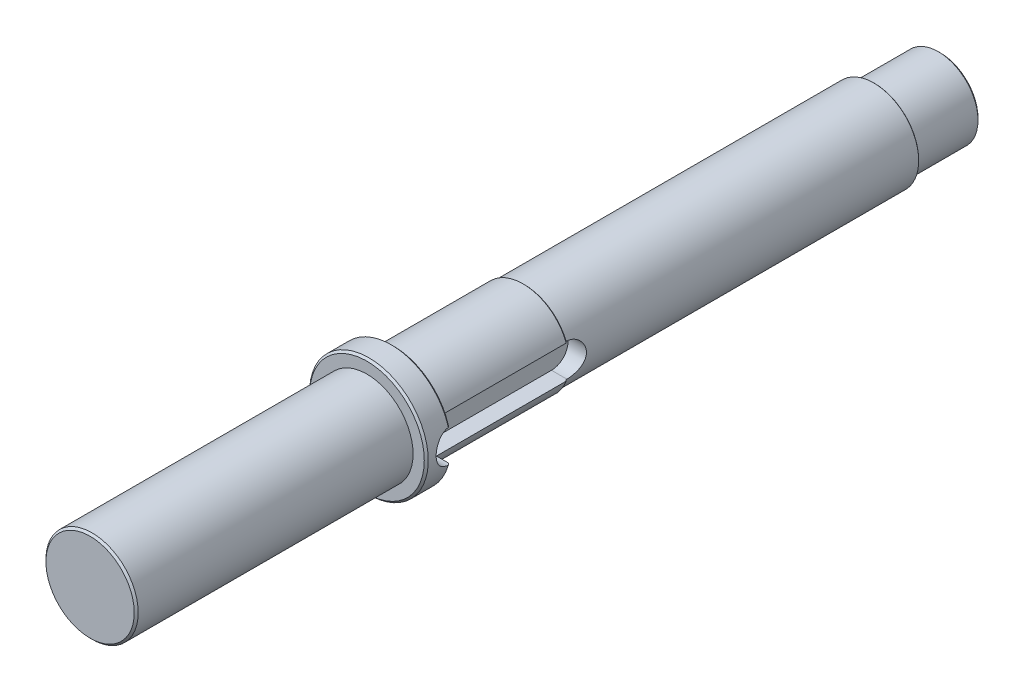
ISO-10303-21;
HEADER;
FILE_DESCRIPTION(('STEP AP214'),'2;1');
FILE_NAME('part.step','',(''),(''),'','','');
FILE_SCHEMA(('AUTOMOTIVE_DESIGN { 1 0 10303 214 1 1 1 1 }'));
ENDSEC;
DATA;
#1=APPLICATION_CONTEXT('core data for automotive mechanical design processes');
#2=APPLICATION_PROTOCOL_DEFINITION('international standard','automotive_design',2000,#1);
#3=PRODUCT_CONTEXT('',#1,'mechanical');
#4=PRODUCT('Part','Part','',(#3));
#5=PRODUCT_RELATED_PRODUCT_CATEGORY('part','',(#4));
#6=PRODUCT_DEFINITION_FORMATION('','',#4);
#7=PRODUCT_DEFINITION_CONTEXT('part definition',#1,'design');
#8=PRODUCT_DEFINITION('design','',#6,#7);
#9=PRODUCT_DEFINITION_SHAPE('','',#8);
#10=(LENGTH_UNIT() NAMED_UNIT(*) SI_UNIT(.MILLI.,.METRE.));
#11=(NAMED_UNIT(*) PLANE_ANGLE_UNIT() SI_UNIT($,.RADIAN.));
#12=(NAMED_UNIT(*) SI_UNIT($,.STERADIAN.) SOLID_ANGLE_UNIT());
#13=UNCERTAINTY_MEASURE_WITH_UNIT(LENGTH_MEASURE(1.E-05),#10,'distance_accuracy_value','');
#14=(GEOMETRIC_REPRESENTATION_CONTEXT(3) GLOBAL_UNCERTAINTY_ASSIGNED_CONTEXT((#13)) GLOBAL_UNIT_ASSIGNED_CONTEXT((#10,
#11,#12)) REPRESENTATION_CONTEXT('',''));
#15=CARTESIAN_POINT('',(0.,0.,0.));
#16=DIRECTION('',(0.,0.,1.));
#17=DIRECTION('',(1.,0.,0.));
#18=AXIS2_PLACEMENT_3D('',#15,#16,#17);
#19=CARTESIAN_POINT('',(9.,0.,63.));
#20=DIRECTION('',(-1.,0.,0.));
#21=DIRECTION('',(0.,0.,1.));
#22=AXIS2_PLACEMENT_3D('',#19,#20,#21);
#23=CYLINDRICAL_SURFACE('',#22,2.5);
#24=DIRECTION('',(-1.,0.,0.));
#25=VECTOR('',#24,1.);
#26=CARTESIAN_POINT('',(9.,-2.5,63.));
#27=LINE('',#26,#25);
#28=CARTESIAN_POINT('',(6.32376470150495,-2.5,63.));
#29=VERTEX_POINT('',#28);
#30=CARTESIAN_POINT('',(4.,-2.5,63.));
#31=VERTEX_POINT('',#30);
#32=EDGE_CURVE('E68',#29,#31,#27,.T.);
#33=ORIENTED_EDGE('',*,*,#32,.F.);
#34=CARTESIAN_POINT('',(6.37356514493163,-2.37016188124623,63.7951934712303));
#35=CARTESIAN_POINT('',(6.36560903279854,-2.39153918947446,63.7315005728365));
#36=CARTESIAN_POINT('',(6.35849112701255,-2.41036712051195,63.6668426227412));
#37=CARTESIAN_POINT('',(6.34611179206517,-2.44278285721172,63.5360436110059));
#38=CARTESIAN_POINT('',(6.34085062324014,-2.45636992806856,63.469902342769));
#39=CARTESIAN_POINT('',(6.33237438368822,-2.47813794354778,63.3367153361462));
#40=CARTESIAN_POINT('',(6.32915584266513,-2.48632805817163,63.2696713304812));
#41=CARTESIAN_POINT('',(6.32484895352499,-2.49726127326526,63.1350969664618));
#42=CARTESIAN_POINT('',(6.32376041690474,-2.50000485574788,63.0675666516763));
#43=CARTESIAN_POINT('',(6.32377327118864,-2.49999028795656,62.8648590757217));
#44=CARTESIAN_POINT('',(6.32815361881067,-2.48898558295727,62.7295727874858));
#45=CARTESIAN_POINT('',(6.34511123416583,-2.44541995148177,62.4631837502152));
#46=CARTESIAN_POINT('',(6.35768691739753,-2.41286319190065,62.3320801976213));
#47=CARTESIAN_POINT('',(6.38940621722796,-2.32756049215717,62.0778306817887));
#48=CARTESIAN_POINT('',(6.40853439592586,-2.27486197318259,61.9546668155758));
#49=CARTESIAN_POINT('',(6.45118956389566,-2.15091475882347,61.7188550864381));
#50=CARTESIAN_POINT('',(6.47471898386582,-2.07965580438688,61.6062130862747));
#51=CARTESIAN_POINT('',(6.5247771783579,-1.91698167943481,61.3893033307046));
#52=CARTESIAN_POINT('',(6.55139172585088,-1.82482711481568,61.2856096730952));
#53=CARTESIAN_POINT('',(6.60390141255396,-1.62455869151092,61.094758085939));
#54=CARTESIAN_POINT('',(6.62979648843883,-1.51644343327828,61.0076016080228));
#55=CARTESIAN_POINT('',(6.67897027851501,-1.28297440843904,60.8495395428462));
#56=CARTESIAN_POINT('',(6.70213632339768,-1.15717390886301,60.7792556255792));
#57=CARTESIAN_POINT('',(6.74221253047313,-0.894528779198144,60.6610825349088));
#58=CARTESIAN_POINT('',(6.75912454561806,-0.757687434966282,60.6131867272147));
#59=CARTESIAN_POINT('',(6.78417607227856,-0.482894271350383,60.5431583111232));
#60=CARTESIAN_POINT('',(6.79265147277447,-0.345225833420529,60.5200361894455));
#61=CARTESIAN_POINT('',(6.80107779298998,-0.0677204874504458,60.497045454306));
#62=CARTESIAN_POINT('',(6.80103144944619,0.0721157099938083,60.4971693754363));
#63=CARTESIAN_POINT('',(6.79263585252244,0.342914834966031,60.5200811589847));
#64=CARTESIAN_POINT('',(6.7846817612591,0.473983381070206,60.541790377567));
#65=CARTESIAN_POINT('',(6.76187851037833,0.730468697604359,60.6054480178424));
#66=CARTESIAN_POINT('',(6.74702881604509,0.855885028908849,60.6473980091052));
#67=CARTESIAN_POINT('',(6.71164586129282,1.099640331127,60.7508714124932));
#68=CARTESIAN_POINT('',(6.69103398485004,1.21785168279074,60.8126674656588));
#69=CARTESIAN_POINT('',(6.64622504566167,1.44250948935482,60.9538377085677));
#70=CARTESIAN_POINT('',(6.62202703939505,1.54895283515157,61.0332165271136));
#71=CARTESIAN_POINT('',(6.5709409617269,1.75341440541438,61.2125290995389));
#72=CARTESIAN_POINT('',(6.54397814009063,1.85062075426388,61.3133685747571));
#73=CARTESIAN_POINT('',(6.49149250626481,2.02707251262323,61.5301310006114));
#74=CARTESIAN_POINT('',(6.46597048291033,2.10630815347015,61.6460621012428));
#75=CARTESIAN_POINT('',(6.41878938621058,2.24604364715354,61.8928318837262));
#76=CARTESIAN_POINT('',(6.3972237934411,2.30611017393436,62.0239347353491));
#77=CARTESIAN_POINT('',(6.36149985463627,2.4029205834103,62.2952828169152));
#78=CARTESIAN_POINT('',(6.34732643309861,2.43971196605896,62.4355087787868));
#79=CARTESIAN_POINT('',(6.33319080596052,2.47605090769648,62.6476007591158));
#80=CARTESIAN_POINT('',(6.32966780273766,2.48502284949996,62.7177413138285));
#81=CARTESIAN_POINT('',(6.32495567501243,2.49699527839482,62.8585897269324));
#82=CARTESIAN_POINT('',(6.32376518117951,2.49999926906551,62.9292972279926));
#83=CARTESIAN_POINT('',(6.32376424415476,2.50000069691632,63.0674122183109));
#84=CARTESIAN_POINT('',(6.32484561048348,2.4972711763191,63.1348201375124));
#85=CARTESIAN_POINT('',(6.32913413223526,2.48638176878866,63.2691641734533));
#86=CARTESIAN_POINT('',(6.33234237795423,2.47821909666634,63.3361000304056));
#87=CARTESIAN_POINT('',(6.34080638270803,2.45648459770579,63.4693188370714));
#88=CARTESIAN_POINT('',(6.34607290689301,2.44288432251917,63.5355964438142));
#89=CARTESIAN_POINT('',(6.35846820594772,2.41042745190464,63.6666368154103));
#90=CARTESIAN_POINT('',(6.36559597619836,2.39157369171062,63.7314003769951));
#91=CARTESIAN_POINT('',(6.37356514493163,2.37016188124622,63.7951934712303));
#92=B_SPLINE_CURVE_WITH_KNOTS('',3,(#34,#35,#36,#37,#38,#39,#40,#41,#42,#43,#44,#45,#46,#47,#48,
#49,#50,#51,#52,#53,#54,#55,#56,#57,#58,#59,#60,#61,#62,#63,#64,#65,#66,#67,#68,#69,#70,#71,#72,
#73,#74,#75,#76,#77,#78,#79,#80,#81,#82,#83,#84,#85,#86,#87,#88,#89,#90,#91),.UNSPECIFIED.,.F.,
.F.,(4,2,2,2,2,2,2,2,2,2,2,2,2,2,2,2,2,2,2,2,2,2,2,2,2,2,2,2,4),(0.,0.202908502676743,
0.405845444219588,0.608436679126223,0.811009984104436,1.21617944255289,1.62127058801634,
2.02541381547106,2.42978090392483,2.85166381466666,3.27358374109724,3.70924410767984,
4.14477529262286,4.56217536526862,4.97944139116718,5.37685366089216,5.77429675288398,
6.17745182754345,6.5807131623901,7.00668105169829,7.4328799400492,7.86812419104442,
8.30247730482171,8.5146360076988,8.72667012263387,8.92883602984699,9.13110565299403,
9.33444765163933,9.5376801212376),.UNSPECIFIED.);
#93=CARTESIAN_POINT('',(6.32376470150495,2.5,63.));
#94=VERTEX_POINT('',#93);
#95=EDGE_CURVE('E137',#29,#94,#92,.T.);
#96=ORIENTED_EDGE('',*,*,#95,.T.);
#97=DIRECTION('',(-1.,0.,0.));
#98=VECTOR('',#97,1.);
#99=CARTESIAN_POINT('',(9.,2.5,63.));
#100=LINE('',#99,#98);
#101=CARTESIAN_POINT('',(4.,2.5,63.));
#102=VERTEX_POINT('',#101);
#103=EDGE_CURVE('E61',#94,#102,#100,.T.);
#104=ORIENTED_EDGE('',*,*,#103,.T.);
#105=CARTESIAN_POINT('',(4.,0.,63.));
#106=DIRECTION('',(1.,0.,0.));
#107=DIRECTION('',(0.,0.,-1.));
#108=AXIS2_PLACEMENT_3D('',#105,#106,#107);
#109=CIRCLE('',#108,2.5);
#110=EDGE_CURVE('E129',#31,#102,#109,.T.);
#111=ORIENTED_EDGE('',*,*,#110,.F.);
#112=EDGE_LOOP('',(#33,#96,#104,#111));
#113=FACE_BOUND('',#112,.T.);
#114=ADVANCED_FACE('F44',(#113),#23,.F.);
#115=CARTESIAN_POINT('',(0.,0.,129.));
#116=DIRECTION('',(0.,0.,-1.));
#117=DIRECTION('',(-1.,0.,0.));
#118=AXIS2_PLACEMENT_3D('',#115,#116,#117);
#119=CYLINDRICAL_SURFACE('',#118,7.);
#120=DIRECTION('',(0.,0.,-1.));
#121=VECTOR('',#120,1.);
#122=CARTESIAN_POINT('',(6.53834841531101,2.5,129.));
#123=LINE('',#122,#121);
#124=CARTESIAN_POINT('',(6.53834841531101,2.5,63.3));
#125=VERTEX_POINT('',#124);
#126=CARTESIAN_POINT('',(6.53834841531101,2.5,83.));
#127=VERTEX_POINT('',#126);
#128=EDGE_CURVE('E412',#125,#127,#123,.F.);
#129=ORIENTED_EDGE('',*,*,#128,.F.);
#130=CARTESIAN_POINT('',(0.,0.,63.3));
#131=DIRECTION('',(0.,0.,1.));
#132=DIRECTION('',(1.,0.,0.));
#133=AXIS2_PLACEMENT_3D('',#130,#131,#132);
#134=CIRCLE('',#133,7.);
#135=CARTESIAN_POINT('',(6.53834841531101,-2.5,63.3));
#136=VERTEX_POINT('',#135);
#137=EDGE_CURVE('E448',#125,#136,#134,.T.);
#138=ORIENTED_EDGE('',*,*,#137,.T.);
#139=DIRECTION('',(0.,0.,-1.));
#140=VECTOR('',#139,1.);
#141=CARTESIAN_POINT('',(6.53834841531101,-2.5,129.));
#142=LINE('',#141,#140);
#143=CARTESIAN_POINT('',(6.53834841531101,-2.5,83.));
#144=VERTEX_POINT('',#143);
#145=EDGE_CURVE('E407',#144,#136,#142,.T.);
#146=ORIENTED_EDGE('',*,*,#145,.F.);
#147=CARTESIAN_POINT('',(0.,0.,83.));
#148=DIRECTION('',(0.,0.,1.));
#149=DIRECTION('',(1.,0.,0.));
#150=AXIS2_PLACEMENT_3D('',#147,#148,#149);
#151=CIRCLE('',#150,7.);
#152=EDGE_CURVE('E157',#127,#144,#151,.T.);
#153=ORIENTED_EDGE('',*,*,#152,.F.);
#154=EDGE_LOOP('',(#129,#138,#146,#153));
#155=FACE_BOUND('',#154,.T.);
#156=ADVANCED_FACE('F220',(#155),#119,.T.);
#157=CARTESIAN_POINT('',(0.,0.,87.));
#158=DIRECTION('',(0.,0.,-1.));
#159=DIRECTION('',(-1.,0.,0.));
#160=AXIS2_PLACEMENT_3D('',#157,#158,#159);
#161=CYLINDRICAL_SURFACE('',#160,9.);
#162=CARTESIAN_POINT('',(0.,0.,86.7000000000001));
#163=DIRECTION('',(0.,0.,1.));
#164=DIRECTION('',(1.,0.,0.));
#165=AXIS2_PLACEMENT_3D('',#162,#163,#164);
#166=CIRCLE('',#165,9.);
#167=CARTESIAN_POINT('',(9.,0.,86.7000000000001));
#168=VERTEX_POINT('',#167);
#169=EDGE_CURVE('E182',#168,#168,#166,.F.);
#170=ORIENTED_EDGE('',*,*,#169,.T.);
#171=EDGE_LOOP('',(#170));
#172=FACE_BOUND('',#171,.T.);
#173=CARTESIAN_POINT('',(8.64580823289529,2.5,83.));
#174=CARTESIAN_POINT('',(8.64579950821757,2.50000830602292,83.0688585199836));
#175=CARTESIAN_POINT('',(8.64663065807681,2.49715524603601,83.1377119002342));
#176=CARTESIAN_POINT('',(8.64990792871954,2.48579096319931,83.2748981823844));
#177=CARTESIAN_POINT('',(8.65235372954183,2.4772808613535,83.3432311846896));
#178=CARTESIAN_POINT('',(8.6587882563543,2.4546926967716,83.4787401301999));
#179=CARTESIAN_POINT('',(8.66277346547357,2.44062732375281,83.5459183488119));
#180=CARTESIAN_POINT('',(8.67215936886944,2.40706322245487,83.6787842144562));
#181=CARTESIAN_POINT('',(8.6775600918511,2.38756438399059,83.7444718312315));
#182=CARTESIAN_POINT('',(8.69565518457922,2.3211450863276,83.9385854375999));
#183=CARTESIAN_POINT('',(8.71025040337274,2.26627569938269,84.0642174618709));
#184=CARTESIAN_POINT('',(8.7428505104496,2.13704900713883,84.3044808215494));
#185=CARTESIAN_POINT('',(8.76085667251656,2.0626844175502,84.419108023139));
#186=CARTESIAN_POINT('',(8.79879412854936,1.89441897395304,84.6372530627462));
#187=CARTESIAN_POINT('',(8.81876164554148,1.80008616533364,84.7404320670644));
#188=CARTESIAN_POINT('',(8.85806142034494,1.59548835100877,84.9297278350093));
#189=CARTESIAN_POINT('',(8.87739357335314,1.48522073288934,85.0158417954271));
#190=CARTESIAN_POINT('',(8.91365243290547,1.24949780504099,85.1700058121654));
#191=CARTESIAN_POINT('',(8.93053115307204,1.12381058827198,85.2377135788813));
#192=CARTESIAN_POINT('',(8.95956074597986,0.862294107712378,85.3509014780864));
#193=CARTESIAN_POINT('',(8.9717127021874,0.726467176659815,85.3963867050267));
#194=CARTESIAN_POINT('',(8.98966308671867,0.452087826563251,85.4627305623294));
#195=CARTESIAN_POINT('',(8.99561125337261,0.313685954719504,85.4841705752483));
#196=CARTESIAN_POINT('',(9.00100868484384,0.0351274681096858,85.5036475046721));
#197=CARTESIAN_POINT('',(9.00045898712353,-0.105028862966262,85.5016881571664));
#198=CARTESIAN_POINT('',(8.99303084531464,-0.379054928934811,85.4748243813654));
#199=CARTESIAN_POINT('',(8.98632591253905,-0.512991760209219,85.4505489989795));
#200=CARTESIAN_POINT('',(8.96754747987061,-0.774808772562582,85.3807623952707));
#201=CARTESIAN_POINT('',(8.95547371543655,-0.902688654850765,85.3352501275264));
#202=CARTESIAN_POINT('',(8.92706237810073,-1.15033469909429,85.2238174539704));
#203=CARTESIAN_POINT('',(8.91068121327166,-1.27000115579177,85.1576870379234));
#204=CARTESIAN_POINT('',(8.87541187730876,-1.49674649921308,85.0070587426061));
#205=CARTESIAN_POINT('',(8.85652322703191,-1.60382297278662,84.9225573509439));
#206=CARTESIAN_POINT('',(8.81753868463739,-1.80609604775247,84.7342817831259));
#207=CARTESIAN_POINT('',(8.7974235289556,-1.90078144217944,84.629961776031));
#208=CARTESIAN_POINT('',(8.75880771863634,-2.0714653277718,84.4066902615497));
#209=CARTESIAN_POINT('',(8.74030751735181,-2.14745858245886,84.287734668071));
#210=CARTESIAN_POINT('',(8.70692961253113,-2.279043092931,84.0373640860905));
#211=CARTESIAN_POINT('',(8.69208091884035,-2.3344726387262,83.9058601594505));
#212=CARTESIAN_POINT('',(8.66804909513355,-2.42219486985499,83.6349559848876));
#213=CARTESIAN_POINT('',(8.65885741633596,-2.45452247840333,83.4955680010343));
#214=CARTESIAN_POINT('',(8.65066448386834,-2.48315519772344,83.2957662361188));
#215=CARTESIAN_POINT('',(8.648846818658,-2.4894721783985,83.2367582336104));
#216=CARTESIAN_POINT('',(8.64641887399254,-2.49789031419067,83.1185098325248));
#217=CARTESIAN_POINT('',(8.6458067220955,-2.49999800738002,83.0592699377821));
#218=CARTESIAN_POINT('',(8.64580823289529,-2.5,83.));
#219=B_SPLINE_CURVE_WITH_KNOTS('',3,(#173,#174,#175,#176,#177,#178,#179,#180,#181,#182,#183,
#184,#185,#186,#187,#188,#189,#190,#191,#192,#193,#194,#195,#196,#197,#198,#199,#200,#201,#202,
#203,#204,#205,#206,#207,#208,#209,#210,#211,#212,#213,#214,#215,#216,#217,#218),.UNSPECIFIED.,
.F.,.F.,(4,2,2,2,2,2,2,2,2,2,2,2,2,2,2,2,2,2,2,2,2,2,4),(0.,0.206502660795448,0.412964413050587,
0.618957254291897,0.824954273161065,1.23648126604288,1.64816224372851,2.06987642360528,
2.49165981952702,2.92082040021561,3.34988255089612,3.76833045963872,4.18671155902949,
4.59364934888086,5.00060719220963,5.41185362819258,5.82317876064753,6.24813326230631,
6.67320667689378,7.10155530371389,7.52925501790107,7.70724135419257,7.88495101767148),.UNSPECIFIED.);
#220=CARTESIAN_POINT('',(8.65101150155287,2.48193472919817,83.3));
#221=VERTEX_POINT('',#220);
#222=CARTESIAN_POINT('',(8.65101150155287,-2.48193472919817,83.3));
#223=VERTEX_POINT('',#222);
#224=EDGE_CURVE('E148',#221,#223,#219,.T.);
#225=ORIENTED_EDGE('',*,*,#224,.F.);
#226=CARTESIAN_POINT('',(0.,0.,83.3));
#227=DIRECTION('',(0.,0.,1.));
#228=DIRECTION('',(1.,0.,0.));
#229=AXIS2_PLACEMENT_3D('',#226,#227,#228);
#230=CIRCLE('',#229,9.);
#231=EDGE_CURVE('E423',#221,#223,#230,.T.);
#232=ORIENTED_EDGE('',*,*,#231,.T.);
#233=EDGE_LOOP('',(#225,#232));
#234=FACE_BOUND('',#233,.T.);
#235=ADVANCED_FACE('F159',(#172,#234),#161,.T.);
#236=CARTESIAN_POINT('',(0.,0.,83.));
#237=DIRECTION('',(0.,0.,1.));
#238=DIRECTION('',(1.,0.,0.));
#239=AXIS2_PLACEMENT_3D('',#236,#237,#238);
#240=PLANE('',#239);
#241=DIRECTION('',(-1.,0.,0.));
#242=VECTOR('',#241,1.);
#243=CARTESIAN_POINT('',(9.,-2.5,83.));
#244=LINE('',#243,#242);
#245=CARTESIAN_POINT('',(8.33306666239983,-2.5,83.));
#246=VERTEX_POINT('',#245);
#247=EDGE_CURVE('E119',#246,#144,#244,.T.);
#248=ORIENTED_EDGE('',*,*,#247,.F.);
#249=CARTESIAN_POINT('',(0.,0.,83.));
#250=DIRECTION('',(0.,0.,1.));
#251=DIRECTION('',(1.,0.,0.));
#252=AXIS2_PLACEMENT_3D('',#249,#250,#251);
#253=CIRCLE('',#252,8.69999999999997);
#254=CARTESIAN_POINT('',(8.33306666239983,2.5,83.));
#255=VERTEX_POINT('',#254);
#256=EDGE_CURVE('E446',#246,#255,#253,.F.);
#257=ORIENTED_EDGE('',*,*,#256,.T.);
#258=DIRECTION('',(-1.,0.,0.));
#259=VECTOR('',#258,1.);
#260=CARTESIAN_POINT('',(9.,2.5,83.));
#261=LINE('',#260,#259);
#262=EDGE_CURVE('E145',#255,#127,#261,.T.);
#263=ORIENTED_EDGE('',*,*,#262,.T.);
#264=ORIENTED_EDGE('',*,*,#152,.T.);
#265=EDGE_LOOP('',(#248,#257,#263,#264));
#266=FACE_BOUND('',#265,.T.);
#267=ADVANCED_FACE('F283',(#266),#240,.F.);
#268=CARTESIAN_POINT('',(0.,0.,128.7));
#269=DIRECTION('',(0.,0.,1.));
#270=DIRECTION('',(1.,0.,0.));
#271=AXIS2_PLACEMENT_3D('',#268,#269,#270);
#272=CIRCLE('',#271,7.);
#273=CARTESIAN_POINT('',(7.,0.,128.7));
#274=VERTEX_POINT('',#273);
#275=EDGE_CURVE('E418',#274,#274,#272,.F.);
#276=ORIENTED_EDGE('',*,*,#275,.T.);
#277=EDGE_LOOP('',(#276));
#278=FACE_BOUND('',#277,.T.);
#279=CARTESIAN_POINT('',(0.,0.,87.));
#280=DIRECTION('',(0.,0.,1.));
#281=DIRECTION('',(1.,0.,0.));
#282=AXIS2_PLACEMENT_3D('',#279,#280,#281);
#283=CIRCLE('',#282,7.);
#284=CARTESIAN_POINT('',(7.,0.,87.));
#285=VERTEX_POINT('',#284);
#286=EDGE_CURVE('E156',#285,#285,#283,.T.);
#287=ORIENTED_EDGE('',*,*,#286,.T.);
#288=EDGE_LOOP('',(#287));
#289=FACE_BOUND('',#288,.T.);
#290=ADVANCED_FACE('F226',(#278,#289),#119,.T.);
#291=CARTESIAN_POINT('',(0.,0.,129.));
#292=DIRECTION('',(0.,0.,1.));
#293=DIRECTION('',(1.,0.,0.));
#294=AXIS2_PLACEMENT_3D('',#291,#292,#293);
#295=PLANE('',#294);
#296=CARTESIAN_POINT('',(0.,0.,129.));
#297=DIRECTION('',(0.,0.,1.));
#298=DIRECTION('',(1.,0.,0.));
#299=AXIS2_PLACEMENT_3D('',#296,#297,#298);
#300=CIRCLE('',#299,6.70000000000003);
#301=CARTESIAN_POINT('',(6.70000000000003,0.,129.));
#302=VERTEX_POINT('',#301);
#303=EDGE_CURVE('E410',#302,#302,#300,.T.);
#304=ORIENTED_EDGE('',*,*,#303,.T.);
#305=EDGE_LOOP('',(#304));
#306=FACE_BOUND('',#305,.T.);
#307=ADVANCED_FACE('F270',(#306),#295,.T.);
#308=CARTESIAN_POINT('',(0.,0.,87.));
#309=DIRECTION('',(0.,0.,1.));
#310=DIRECTION('',(1.,0.,0.));
#311=AXIS2_PLACEMENT_3D('',#308,#309,#310);
#312=PLANE('',#311);
#313=CARTESIAN_POINT('',(0.,0.,87.));
#314=DIRECTION('',(0.,0.,1.));
#315=DIRECTION('',(1.,0.,0.));
#316=AXIS2_PLACEMENT_3D('',#313,#314,#315);
#317=CIRCLE('',#316,8.70000000000004);
#318=CARTESIAN_POINT('',(8.70000000000004,0.,87.));
#319=VERTEX_POINT('',#318);
#320=EDGE_CURVE('E421',#319,#319,#317,.T.);
#321=ORIENTED_EDGE('',*,*,#320,.T.);
#322=EDGE_LOOP('',(#321));
#323=FACE_BOUND('',#322,.T.);
#324=ORIENTED_EDGE('',*,*,#286,.F.);
#325=EDGE_LOOP('',(#324));
#326=FACE_BOUND('',#325,.T.);
#327=ADVANCED_FACE('F167',(#323,#326),#312,.T.);
#328=CARTESIAN_POINT('',(9.,0.,83.));
#329=DIRECTION('',(-1.,0.,0.));
#330=DIRECTION('',(0.,0.,1.));
#331=AXIS2_PLACEMENT_3D('',#328,#329,#330);
#332=CYLINDRICAL_SURFACE('',#331,2.5);
#333=ORIENTED_EDGE('',*,*,#224,.T.);
#334=CARTESIAN_POINT('',(8.65101150155287,-2.48193472919817,83.3));
#335=CARTESIAN_POINT('',(8.59774588886833,-2.48793626186972,83.2504713313555));
#336=CARTESIAN_POINT('',(8.54461767862646,-2.49244246743923,83.2007069964235));
#337=CARTESIAN_POINT('',(8.43863606558872,-2.49846422422866,83.1007069964007));
#338=CARTESIAN_POINT('',(8.38578266277958,-2.4999797755931,83.0504713313327));
#339=CARTESIAN_POINT('',(8.33306666239983,-2.5,83.));
#340=B_SPLINE_CURVE_WITH_KNOTS('',3,(#334,#335,#336,#337,#338,#339),.UNSPECIFIED.,.F.,.F.,(4,2,
4),(0.,0.218802684604842,0.437605358636508),.UNSPECIFIED.);
#341=EDGE_CURVE('E181',#223,#246,#340,.T.);
#342=ORIENTED_EDGE('',*,*,#341,.T.);
#343=ORIENTED_EDGE('',*,*,#247,.T.);
#344=CARTESIAN_POINT('',(4.,-2.5,83.));
#345=VERTEX_POINT('',#344);
#346=EDGE_CURVE('E111',#144,#345,#244,.T.);
#347=ORIENTED_EDGE('',*,*,#346,.T.);
#348=CARTESIAN_POINT('',(4.,0.,83.));
#349=DIRECTION('',(1.,0.,0.));
#350=DIRECTION('',(0.,0.,-1.));
#351=AXIS2_PLACEMENT_3D('',#348,#349,#350);
#352=CIRCLE('',#351,2.5);
#353=CARTESIAN_POINT('',(4.,2.5,83.));
#354=VERTEX_POINT('',#353);
#355=EDGE_CURVE('E117',#354,#345,#352,.T.);
#356=ORIENTED_EDGE('',*,*,#355,.F.);
#357=EDGE_CURVE('E143',#127,#354,#261,.T.);
#358=ORIENTED_EDGE('',*,*,#357,.F.);
#359=ORIENTED_EDGE('',*,*,#262,.F.);
#360=CARTESIAN_POINT('',(8.33306666239983,2.5,83.));
#361=CARTESIAN_POINT('',(8.38578266277958,2.4999797755931,83.0504713313327));
#362=CARTESIAN_POINT('',(8.43863606558872,2.49846422422866,83.1007069964007));
#363=CARTESIAN_POINT('',(8.54461767862645,2.49244246743923,83.2007069964235));
#364=CARTESIAN_POINT('',(8.59774588886832,2.48793626186972,83.2504713313555));
#365=CARTESIAN_POINT('',(8.65101150155287,2.48193472919817,83.3));
#366=B_SPLINE_CURVE_WITH_KNOTS('',3,(#360,#361,#362,#363,#364,#365),.UNSPECIFIED.,.F.,.F.,(4,2,
4),(0.,0.218802674031663,0.437605358636504),.UNSPECIFIED.);
#367=EDGE_CURVE('E174',#255,#221,#366,.T.);
#368=ORIENTED_EDGE('',*,*,#367,.T.);
#369=EDGE_LOOP('',(#333,#342,#343,#347,#356,#358,#359,#368));
#370=FACE_BOUND('',#369,.T.);
#371=ADVANCED_FACE('F114',(#370),#332,.F.);
#372=CARTESIAN_POINT('',(9.,-2.5,83.));
#373=DIRECTION('',(0.,1.,0.));
#374=DIRECTION('',(0.,0.,1.));
#375=AXIS2_PLACEMENT_3D('',#372,#373,#374);
#376=PLANE('',#375);
#377=ORIENTED_EDGE('',*,*,#145,.T.);
#378=CARTESIAN_POINT('',(6.53834841531101,-2.5,63.3));
#379=CARTESIAN_POINT('',(6.48472566113769,-2.5,63.2499098132056));
#380=CARTESIAN_POINT('',(6.43106092545432,-2.5,63.1998647201937));
#381=CARTESIAN_POINT('',(6.32364748940925,-2.5,63.0998647201909));
#382=CARTESIAN_POINT('',(6.26989878904495,-2.5,63.0499098132029));
#383=CARTESIAN_POINT('',(6.21610810716802,-2.5,63.));
#384=B_SPLINE_CURVE_WITH_KNOTS('',3,(#378,#379,#380,#381,#382,#383),.UNSPECIFIED.,.F.,.F.,(4,2,
4),(0.,0.220135723395464,0.44027145358787),.UNSPECIFIED.);
#385=CARTESIAN_POINT('',(6.32376470150495,-2.5,63.1));
#386=VERTEX_POINT('',#385);
#387=EDGE_CURVE('E450',#136,#386,#384,.T.);
#388=ORIENTED_EDGE('',*,*,#387,.T.);
#389=DIRECTION('',(0.,0.,-1.));
#390=VECTOR('',#389,1.);
#391=CARTESIAN_POINT('',(6.32376470150495,-2.5,115.142869257817));
#392=LINE('',#391,#390);
#393=EDGE_CURVE('E54',#386,#29,#392,.T.);
#394=ORIENTED_EDGE('',*,*,#393,.T.);
#395=ORIENTED_EDGE('',*,*,#32,.T.);
#396=DIRECTION('',(0.,0.,-1.));
#397=VECTOR('',#396,1.);
#398=CARTESIAN_POINT('',(4.,-2.5,83.));
#399=LINE('',#398,#397);
#400=EDGE_CURVE('E125',#345,#31,#399,.T.);
#401=ORIENTED_EDGE('',*,*,#400,.F.);
#402=ORIENTED_EDGE('',*,*,#346,.F.);
#403=EDGE_LOOP('',(#377,#388,#394,#395,#401,#402));
#404=FACE_BOUND('',#403,.T.);
#405=ADVANCED_FACE('F126',(#404),#376,.T.);
#406=CARTESIAN_POINT('',(9.,2.5,83.));
#407=DIRECTION('',(0.,-1.,0.));
#408=DIRECTION('',(0.,0.,-1.));
#409=AXIS2_PLACEMENT_3D('',#406,#407,#408);
#410=PLANE('',#409);
#411=ORIENTED_EDGE('',*,*,#103,.F.);
#412=DIRECTION('',(0.,0.,-1.));
#413=VECTOR('',#412,1.);
#414=CARTESIAN_POINT('',(6.32376470150495,2.5,115.142869257817));
#415=LINE('',#414,#413);
#416=CARTESIAN_POINT('',(6.32376470150495,2.5,63.1));
#417=VERTEX_POINT('',#416);
#418=EDGE_CURVE('E13',#417,#94,#415,.T.);
#419=ORIENTED_EDGE('',*,*,#418,.F.);
#420=CARTESIAN_POINT('',(6.21610810716802,2.5,63.));
#421=CARTESIAN_POINT('',(6.26989878904495,2.5,63.0499098132029));
#422=CARTESIAN_POINT('',(6.32364748940925,2.5,63.0998647201909));
#423=CARTESIAN_POINT('',(6.43106092545432,2.5,63.1998647201937));
#424=CARTESIAN_POINT('',(6.48472566113769,2.5,63.2499098132056));
#425=CARTESIAN_POINT('',(6.53834841531101,2.5,63.3));
#426=B_SPLINE_CURVE_WITH_KNOTS('',3,(#420,#421,#422,#423,#424,#425),.UNSPECIFIED.,.F.,.F.,(4,2,
4),(0.,0.220135730192405,0.440271453587868),.UNSPECIFIED.);
#427=EDGE_CURVE('E440',#417,#125,#426,.T.);
#428=ORIENTED_EDGE('',*,*,#427,.T.);
#429=ORIENTED_EDGE('',*,*,#128,.T.);
#430=ORIENTED_EDGE('',*,*,#357,.T.);
#431=DIRECTION('',(0.,0.,1.));
#432=VECTOR('',#431,1.);
#433=CARTESIAN_POINT('',(4.,2.5,83.));
#434=LINE('',#433,#432);
#435=EDGE_CURVE('E133',#102,#354,#434,.T.);
#436=ORIENTED_EDGE('',*,*,#435,.F.);
#437=EDGE_LOOP('',(#411,#419,#428,#429,#430,#436));
#438=FACE_BOUND('',#437,.T.);
#439=ADVANCED_FACE('F229',(#438),#410,.T.);
#440=CARTESIAN_POINT('',(4.,0.,83.));
#441=DIRECTION('',(1.,0.,0.));
#442=DIRECTION('',(0.,0.,-1.));
#443=AXIS2_PLACEMENT_3D('',#440,#441,#442);
#444=PLANE('',#443);
#445=ORIENTED_EDGE('',*,*,#355,.T.);
#446=ORIENTED_EDGE('',*,*,#400,.T.);
#447=ORIENTED_EDGE('',*,*,#110,.T.);
#448=ORIENTED_EDGE('',*,*,#435,.T.);
#449=EDGE_LOOP('',(#445,#446,#447,#448));
#450=FACE_BOUND('',#449,.T.);
#451=ADVANCED_FACE('F132',(#450),#444,.T.);
#452=CARTESIAN_POINT('',(0.,0.,129.));
#453=DIRECTION('',(0.,0.,-1.));
#454=DIRECTION('',(-1.,0.,0.));
#455=AXIS2_PLACEMENT_3D('',#452,#453,#454);
#456=CONICAL_SURFACE('',#455,6.70000000000003,0.785398163397461);
#457=ORIENTED_EDGE('',*,*,#275,.F.);
#458=EDGE_LOOP('',(#457));
#459=FACE_BOUND('',#458,.T.);
#460=ORIENTED_EDGE('',*,*,#303,.F.);
#461=EDGE_LOOP('',(#460));
#462=FACE_BOUND('',#461,.T.);
#463=ADVANCED_FACE('F247',(#459,#462),#456,.T.);
#464=CARTESIAN_POINT('',(0.,0.,87.));
#465=DIRECTION('',(0.,0.,-1.));
#466=DIRECTION('',(-1.,0.,0.));
#467=AXIS2_PLACEMENT_3D('',#464,#465,#466);
#468=CONICAL_SURFACE('',#467,8.70000000000004,0.78539816339746);
#469=ORIENTED_EDGE('',*,*,#169,.F.);
#470=EDGE_LOOP('',(#469));
#471=FACE_BOUND('',#470,.T.);
#472=ORIENTED_EDGE('',*,*,#320,.F.);
#473=EDGE_LOOP('',(#472));
#474=FACE_BOUND('',#473,.T.);
#475=ADVANCED_FACE('F199',(#471,#474),#468,.T.);
#476=CARTESIAN_POINT('',(0.,0.,83.3));
#477=DIRECTION('',(0.,0.,1.));
#478=DIRECTION('',(1.,0.,0.));
#479=AXIS2_PLACEMENT_3D('',#476,#477,#478);
#480=CONICAL_SURFACE('',#479,9.,0.785398163397437);
#481=ORIENTED_EDGE('',*,*,#367,.F.);
#482=ORIENTED_EDGE('',*,*,#256,.F.);
#483=ORIENTED_EDGE('',*,*,#341,.F.);
#484=ORIENTED_EDGE('',*,*,#231,.F.);
#485=EDGE_LOOP('',(#481,#482,#483,#484));
#486=FACE_BOUND('',#485,.T.);
#487=ADVANCED_FACE('F190',(#486),#480,.T.);
#488=CARTESIAN_POINT('',(0.,0.,115.142869257817));
#489=DIRECTION('',(0.,0.,-1.));
#490=DIRECTION('',(-1.,0.,0.));
#491=AXIS2_PLACEMENT_3D('',#488,#489,#490);
#492=CYLINDRICAL_SURFACE('',#491,6.8);
#493=CARTESIAN_POINT('',(0.,0.,10.1));
#494=DIRECTION('',(0.,0.,1.));
#495=DIRECTION('',(1.,0.,0.));
#496=AXIS2_PLACEMENT_3D('',#493,#494,#495);
#497=CIRCLE('',#496,6.8);
#498=CARTESIAN_POINT('',(6.8,0.,10.1));
#499=VERTEX_POINT('',#498);
#500=EDGE_CURVE('E237',#499,#499,#497,.F.);
#501=ORIENTED_EDGE('',*,*,#500,.F.);
#502=EDGE_LOOP('',(#501));
#503=FACE_BOUND('',#502,.T.);
#504=ORIENTED_EDGE('',*,*,#95,.F.);
#505=ORIENTED_EDGE('',*,*,#393,.F.);
#506=CARTESIAN_POINT('',(0.,0.,63.1));
#507=DIRECTION('',(0.,0.,1.));
#508=DIRECTION('',(1.,0.,0.));
#509=AXIS2_PLACEMENT_3D('',#506,#507,#508);
#510=CIRCLE('',#509,6.8);
#511=EDGE_CURVE('E455',#386,#417,#510,.F.);
#512=ORIENTED_EDGE('',*,*,#511,.T.);
#513=ORIENTED_EDGE('',*,*,#418,.T.);
#514=EDGE_LOOP('',(#504,#505,#512,#513));
#515=FACE_BOUND('',#514,.T.);
#516=ADVANCED_FACE('F198',(#503,#515),#492,.T.);
#517=CARTESIAN_POINT('',(0.,0.,0.));
#518=DIRECTION('',(0.,0.,1.));
#519=DIRECTION('',(1.,0.,0.));
#520=AXIS2_PLACEMENT_3D('',#517,#518,#519);
#521=PLANE('',#520);
#522=CARTESIAN_POINT('',(0.,0.,0.));
#523=DIRECTION('',(0.,0.,1.));
#524=DIRECTION('',(1.,0.,0.));
#525=AXIS2_PLACEMENT_3D('',#522,#523,#524);
#526=CIRCLE('',#525,5.7);
#527=CARTESIAN_POINT('',(5.7,0.,0.));
#528=VERTEX_POINT('',#527);
#529=EDGE_CURVE('E404',#528,#528,#526,.F.);
#530=ORIENTED_EDGE('',*,*,#529,.T.);
#531=EDGE_LOOP('',(#530));
#532=FACE_BOUND('',#531,.T.);
#533=ADVANCED_FACE('F241',(#532),#521,.F.);
#534=CARTESIAN_POINT('',(0.,0.,0.));
#535=DIRECTION('',(0.,0.,1.));
#536=DIRECTION('',(1.,0.,0.));
#537=AXIS2_PLACEMENT_3D('',#534,#535,#536);
#538=CONICAL_SURFACE('',#537,5.7,0.785398163397473);
#539=CARTESIAN_POINT('',(0.,0.,0.299999999999989));
#540=DIRECTION('',(0.,0.,1.));
#541=DIRECTION('',(1.,0.,0.));
#542=AXIS2_PLACEMENT_3D('',#539,#540,#541);
#543=CIRCLE('',#542,6.);
#544=CARTESIAN_POINT('',(6.,0.,0.299999999999989));
#545=VERTEX_POINT('',#544);
#546=EDGE_CURVE('E406',#545,#545,#543,.T.);
#547=ORIENTED_EDGE('',*,*,#546,.F.);
#548=EDGE_LOOP('',(#547));
#549=FACE_BOUND('',#548,.T.);
#550=ORIENTED_EDGE('',*,*,#529,.F.);
#551=EDGE_LOOP('',(#550));
#552=FACE_BOUND('',#551,.T.);
#553=ADVANCED_FACE('F244',(#549,#552),#538,.T.);
#554=CARTESIAN_POINT('',(0.,0.,10.));
#555=DIRECTION('',(0.,0.,-1.));
#556=DIRECTION('',(-1.,0.,0.));
#557=AXIS2_PLACEMENT_3D('',#554,#555,#556);
#558=CYLINDRICAL_SURFACE('',#557,6.);
#559=ORIENTED_EDGE('',*,*,#546,.T.);
#560=EDGE_LOOP('',(#559));
#561=FACE_BOUND('',#560,.T.);
#562=CARTESIAN_POINT('',(0.,0.,10.));
#563=DIRECTION('',(0.,0.,-1.));
#564=DIRECTION('',(-1.,0.,0.));
#565=AXIS2_PLACEMENT_3D('',#562,#563,#564);
#566=CIRCLE('',#565,6.);
#567=CARTESIAN_POINT('',(-6.,0.,10.));
#568=VERTEX_POINT('',#567);
#569=EDGE_CURVE('E134',#568,#568,#566,.T.);
#570=ORIENTED_EDGE('',*,*,#569,.T.);
#571=EDGE_LOOP('',(#570));
#572=FACE_BOUND('',#571,.T.);
#573=ADVANCED_FACE('F214',(#561,#572),#558,.T.);
#574=CARTESIAN_POINT('',(0.,0.,10.));
#575=DIRECTION('',(0.,0.,-1.));
#576=DIRECTION('',(-1.,0.,0.));
#577=AXIS2_PLACEMENT_3D('',#574,#575,#576);
#578=PLANE('',#577);
#579=CARTESIAN_POINT('',(0.,0.,10.));
#580=DIRECTION('',(0.,0.,-1.));
#581=DIRECTION('',(-1.,0.,0.));
#582=AXIS2_PLACEMENT_3D('',#579,#580,#581);
#583=CIRCLE('',#582,6.70000000000003);
#584=CARTESIAN_POINT('',(-6.70000000000003,0.,10.));
#585=VERTEX_POINT('',#584);
#586=EDGE_CURVE('E469',#585,#585,#583,.T.);
#587=ORIENTED_EDGE('',*,*,#586,.T.);
#588=EDGE_LOOP('',(#587));
#589=FACE_BOUND('',#588,.T.);
#590=ORIENTED_EDGE('',*,*,#569,.F.);
#591=EDGE_LOOP('',(#590));
#592=FACE_BOUND('',#591,.T.);
#593=ADVANCED_FACE('F207',(#589,#592),#578,.T.);
#594=CARTESIAN_POINT('',(0.,0.,9.99999999999999));
#595=DIRECTION('',(0.,0.,1.));
#596=DIRECTION('',(1.,0.,0.));
#597=AXIS2_PLACEMENT_3D('',#594,#595,#596);
#598=CONICAL_SURFACE('',#597,6.70000000000003,0.785398163397438);
#599=ORIENTED_EDGE('',*,*,#586,.F.);
#600=EDGE_LOOP('',(#599));
#601=FACE_BOUND('',#600,.T.);
#602=ORIENTED_EDGE('',*,*,#500,.T.);
#603=EDGE_LOOP('',(#602));
#604=FACE_BOUND('',#603,.T.);
#605=ADVANCED_FACE('F202',(#601,#604),#598,.T.);
#606=CARTESIAN_POINT('',(0.,0.,63.3));
#607=DIRECTION('',(0.,0.,1.));
#608=DIRECTION('',(1.,0.,0.));
#609=AXIS2_PLACEMENT_3D('',#606,#607,#608);
#610=CONICAL_SURFACE('',#609,7.,0.785398163397438);
#611=ORIENTED_EDGE('',*,*,#427,.F.);
#612=ORIENTED_EDGE('',*,*,#511,.F.);
#613=ORIENTED_EDGE('',*,*,#387,.F.);
#614=ORIENTED_EDGE('',*,*,#137,.F.);
#615=EDGE_LOOP('',(#611,#612,#613,#614));
#616=FACE_BOUND('',#615,.T.);
#617=ADVANCED_FACE('F47',(#616),#610,.T.);
#618=CLOSED_SHELL('',(#114,#156,#235,#267,#290,#307,#327,#371,#405,#439,#451,#463,#475,#487,
#516,#533,#553,#573,#593,#605,#617));
#619=MANIFOLD_SOLID_BREP('B2',#618);
#620=ADVANCED_BREP_SHAPE_REPRESENTATION('',(#18,#619),#14);
#621=SHAPE_DEFINITION_REPRESENTATION(#9,#620);
ENDSEC;
END-ISO-10303-21;
